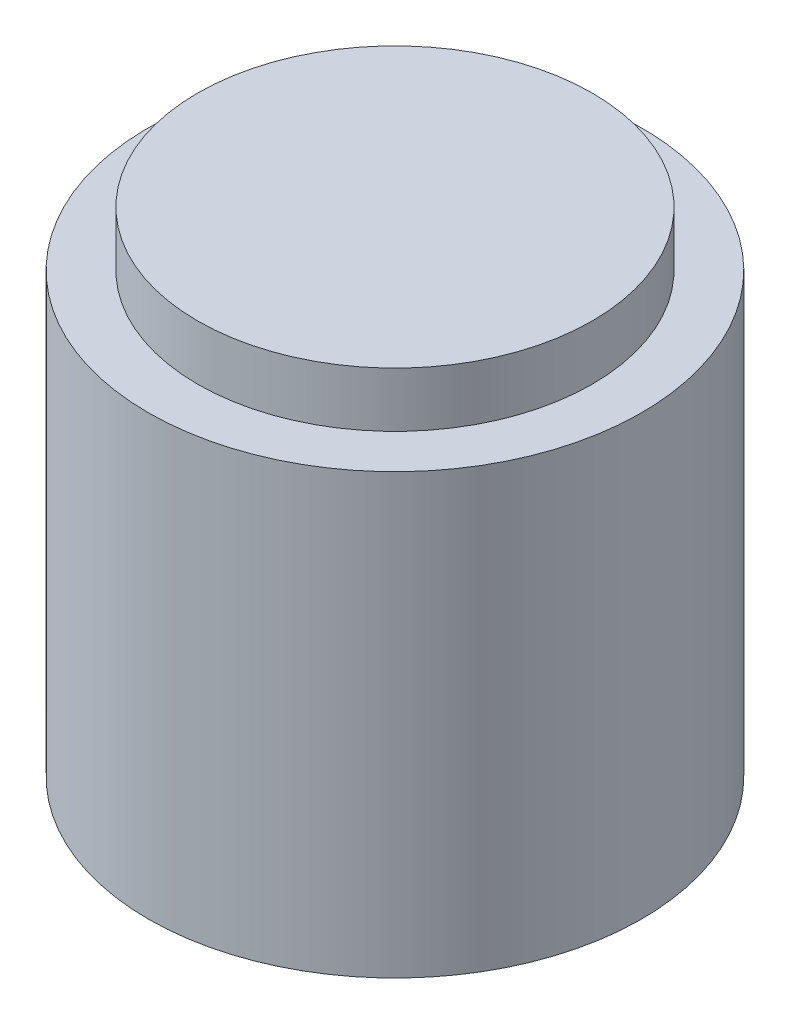
ISO-10303-21;
HEADER;
FILE_DESCRIPTION(('STEP AP214'),'2;1');
FILE_NAME('part.step','',(''),(''),'','','');
FILE_SCHEMA(('AUTOMOTIVE_DESIGN { 1 0 10303 214 1 1 1 1 }'));
ENDSEC;
DATA;
#1=APPLICATION_CONTEXT('core data for automotive mechanical design processes');
#2=APPLICATION_PROTOCOL_DEFINITION('international standard','automotive_design',2000,#1);
#3=PRODUCT_CONTEXT('',#1,'mechanical');
#4=PRODUCT('Part','Part','',(#3));
#5=PRODUCT_RELATED_PRODUCT_CATEGORY('part','',(#4));
#6=PRODUCT_DEFINITION_FORMATION('','',#4);
#7=PRODUCT_DEFINITION_CONTEXT('part definition',#1,'design');
#8=PRODUCT_DEFINITION('design','',#6,#7);
#9=PRODUCT_DEFINITION_SHAPE('','',#8);
#10=(LENGTH_UNIT() NAMED_UNIT(*) SI_UNIT(.MILLI.,.METRE.));
#11=(NAMED_UNIT(*) PLANE_ANGLE_UNIT() SI_UNIT($,.RADIAN.));
#12=(NAMED_UNIT(*) SI_UNIT($,.STERADIAN.) SOLID_ANGLE_UNIT());
#13=UNCERTAINTY_MEASURE_WITH_UNIT(LENGTH_MEASURE(1.E-05),#10,'distance_accuracy_value','');
#14=(GEOMETRIC_REPRESENTATION_CONTEXT(3) GLOBAL_UNCERTAINTY_ASSIGNED_CONTEXT((#13)) GLOBAL_UNIT_ASSIGNED_CONTEXT((#10,
#11,#12)) REPRESENTATION_CONTEXT('',''));
#15=CARTESIAN_POINT('',(0.,0.,0.));
#16=DIRECTION('',(0.,0.,1.));
#17=DIRECTION('',(1.,0.,0.));
#18=AXIS2_PLACEMENT_3D('',#15,#16,#17);
#19=CARTESIAN_POINT('',(0.,12.7,0.));
#20=DIRECTION('',(0.,-1.,0.));
#21=DIRECTION('',(0.,0.,-1.));
#22=AXIS2_PLACEMENT_3D('',#19,#20,#21);
#23=CYLINDRICAL_SURFACE('',#22,7.14375);
#24=CARTESIAN_POINT('',(0.,12.7,0.));
#25=DIRECTION('',(0.,1.,0.));
#26=DIRECTION('',(0.,0.,1.));
#27=AXIS2_PLACEMENT_3D('',#24,#25,#26);
#28=CIRCLE('',#27,7.14375);
#29=CARTESIAN_POINT('',(0.,12.7,7.14375));
#30=VERTEX_POINT('',#29);
#31=EDGE_CURVE('E11',#30,#30,#28,.T.);
#32=ORIENTED_EDGE('',*,*,#31,.F.);
#33=EDGE_LOOP('',(#32));
#34=FACE_BOUND('',#33,.T.);
#35=CARTESIAN_POINT('',(0.,0.,0.));
#36=DIRECTION('',(0.,1.,0.));
#37=DIRECTION('',(0.,0.,1.));
#38=AXIS2_PLACEMENT_3D('',#35,#36,#37);
#39=CIRCLE('',#38,7.14375);
#40=CARTESIAN_POINT('',(0.,0.,7.14375));
#41=VERTEX_POINT('',#40);
#42=EDGE_CURVE('E38',#41,#41,#39,.T.);
#43=ORIENTED_EDGE('',*,*,#42,.T.);
#44=EDGE_LOOP('',(#43));
#45=FACE_BOUND('',#44,.T.);
#46=ADVANCED_FACE('F35',(#34,#45),#23,.T.);
#47=CARTESIAN_POINT('',(0.,12.7,0.));
#48=DIRECTION('',(0.,1.,0.));
#49=DIRECTION('',(0.,0.,1.));
#50=AXIS2_PLACEMENT_3D('',#47,#48,#49);
#51=PLANE('',#50);
#52=CARTESIAN_POINT('',(0.,12.7,0.));
#53=DIRECTION('',(0.,1.,0.));
#54=DIRECTION('',(0.,0.,1.));
#55=AXIS2_PLACEMENT_3D('',#52,#53,#54);
#56=CIRCLE('',#55,5.715);
#57=CARTESIAN_POINT('',(0.,12.7,5.715));
#58=VERTEX_POINT('',#57);
#59=EDGE_CURVE('E54',#58,#58,#56,.T.);
#60=ORIENTED_EDGE('',*,*,#59,.F.);
#61=EDGE_LOOP('',(#60));
#62=FACE_BOUND('',#61,.T.);
#63=ORIENTED_EDGE('',*,*,#31,.T.);
#64=EDGE_LOOP('',(#63));
#65=FACE_BOUND('',#64,.T.);
#66=ADVANCED_FACE('F73',(#62,#65),#51,.T.);
#67=CARTESIAN_POINT('',(0.,0.,0.));
#68=DIRECTION('',(0.,1.,0.));
#69=DIRECTION('',(0.,0.,1.));
#70=AXIS2_PLACEMENT_3D('',#67,#68,#69);
#71=PLANE('',#70);
#72=CARTESIAN_POINT('',(0.,0.,0.));
#73=DIRECTION('',(0.,-1.,0.));
#74=DIRECTION('',(0.,0.,-1.));
#75=AXIS2_PLACEMENT_3D('',#72,#73,#74);
#76=CIRCLE('',#75,3.17499999999999);
#77=CARTESIAN_POINT('',(0.,0.,-3.17499999999999));
#78=VERTEX_POINT('',#77);
#79=EDGE_CURVE('E55',#78,#78,#76,.T.);
#80=ORIENTED_EDGE('',*,*,#79,.F.);
#81=EDGE_LOOP('',(#80));
#82=FACE_BOUND('',#81,.T.);
#83=ORIENTED_EDGE('',*,*,#42,.F.);
#84=EDGE_LOOP('',(#83));
#85=FACE_BOUND('',#84,.T.);
#86=ADVANCED_FACE('F70',(#82,#85),#71,.F.);
#87=CARTESIAN_POINT('',(0.,14.2875,0.));
#88=DIRECTION('',(0.,-1.,0.));
#89=DIRECTION('',(0.,0.,-1.));
#90=AXIS2_PLACEMENT_3D('',#87,#88,#89);
#91=CYLINDRICAL_SURFACE('',#90,5.715);
#92=CARTESIAN_POINT('',(0.,14.2875,0.));
#93=DIRECTION('',(0.,1.,0.));
#94=DIRECTION('',(0.,0.,1.));
#95=AXIS2_PLACEMENT_3D('',#92,#93,#94);
#96=CIRCLE('',#95,5.715);
#97=CARTESIAN_POINT('',(0.,14.2875,5.715));
#98=VERTEX_POINT('',#97);
#99=EDGE_CURVE('E58',#98,#98,#96,.T.);
#100=ORIENTED_EDGE('',*,*,#99,.F.);
#101=EDGE_LOOP('',(#100));
#102=FACE_BOUND('',#101,.T.);
#103=ORIENTED_EDGE('',*,*,#59,.T.);
#104=EDGE_LOOP('',(#103));
#105=FACE_BOUND('',#104,.T.);
#106=ADVANCED_FACE('F72',(#102,#105),#91,.T.);
#107=CARTESIAN_POINT('',(0.,14.2875,0.));
#108=DIRECTION('',(0.,1.,0.));
#109=DIRECTION('',(0.,0.,1.));
#110=AXIS2_PLACEMENT_3D('',#107,#108,#109);
#111=PLANE('',#110);
#112=ORIENTED_EDGE('',*,*,#99,.T.);
#113=EDGE_LOOP('',(#112));
#114=FACE_BOUND('',#113,.T.);
#115=ADVANCED_FACE('F48',(#114),#111,.T.);
#116=CARTESIAN_POINT('',(0.,11.1125,0.));
#117=DIRECTION('',(0.,-1.,0.));
#118=DIRECTION('',(0.,0.,-1.));
#119=AXIS2_PLACEMENT_3D('',#116,#117,#118);
#120=CONICAL_SURFACE('',#119,3.175,1.02974425867665);
#121=CARTESIAN_POINT('',(0.,13.0202324654125,0.));
#122=VERTEX_POINT('',#121);
#123=VERTEX_LOOP('',#122);
#124=FACE_BOUND('',#123,.T.);
#125=CARTESIAN_POINT('',(0.,11.1125,0.));
#126=DIRECTION('',(0.,-1.,0.));
#127=DIRECTION('',(0.,0.,-1.));
#128=AXIS2_PLACEMENT_3D('',#125,#126,#127);
#129=CIRCLE('',#128,3.175);
#130=CARTESIAN_POINT('',(0.,11.1125,-3.175));
#131=VERTEX_POINT('',#130);
#132=EDGE_CURVE('E52',#131,#131,#129,.T.);
#133=ORIENTED_EDGE('',*,*,#132,.T.);
#134=EDGE_LOOP('',(#133));
#135=FACE_BOUND('',#134,.T.);
#136=ADVANCED_FACE('F44',(#124,#135),#120,.F.);
#137=CARTESIAN_POINT('',(0.,0.,0.));
#138=DIRECTION('',(0.,-1.,0.));
#139=DIRECTION('',(0.,0.,-1.));
#140=AXIS2_PLACEMENT_3D('',#137,#138,#139);
#141=CYLINDRICAL_SURFACE('',#140,3.17499999999999);
#142=ORIENTED_EDGE('',*,*,#132,.F.);
#143=EDGE_LOOP('',(#142));
#144=FACE_BOUND('',#143,.T.);
#145=ORIENTED_EDGE('',*,*,#79,.T.);
#146=EDGE_LOOP('',(#145));
#147=FACE_BOUND('',#146,.T.);
#148=ADVANCED_FACE('F47',(#144,#147),#141,.F.);
#149=CLOSED_SHELL('',(#46,#66,#86,#106,#115,#136,#148));
#150=MANIFOLD_SOLID_BREP('B2',#149);
#151=ADVANCED_BREP_SHAPE_REPRESENTATION('',(#18,#150),#14);
#152=SHAPE_DEFINITION_REPRESENTATION(#9,#151);
ENDSEC;
END-ISO-10303-21;
